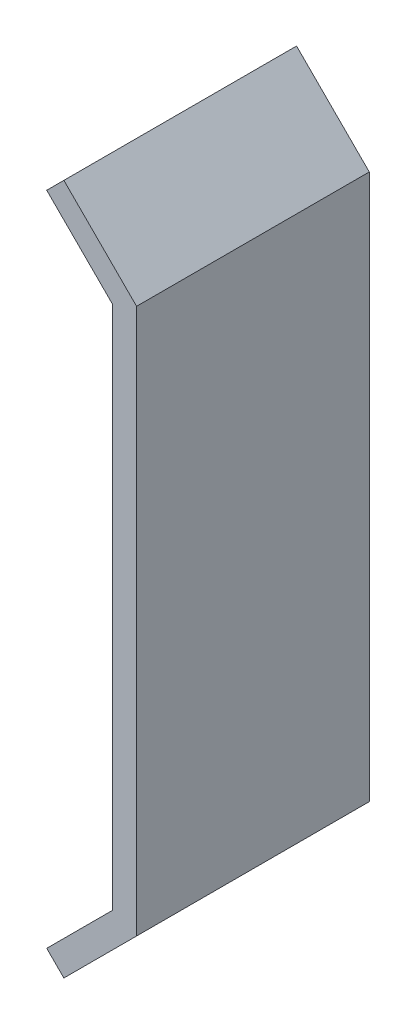
ISO-10303-21;
HEADER;
FILE_DESCRIPTION(('STEP AP214'),'2;1');
FILE_NAME('part.step','',(''),(''),'','','');
FILE_SCHEMA(('AUTOMOTIVE_DESIGN { 1 0 10303 214 1 1 1 1 }'));
ENDSEC;
DATA;
#1=APPLICATION_CONTEXT('core data for automotive mechanical design processes');
#2=APPLICATION_PROTOCOL_DEFINITION('international standard','automotive_design',2000,#1);
#3=PRODUCT_CONTEXT('',#1,'mechanical');
#4=PRODUCT('Part','Part','',(#3));
#5=PRODUCT_RELATED_PRODUCT_CATEGORY('part','',(#4));
#6=PRODUCT_DEFINITION_FORMATION('','',#4);
#7=PRODUCT_DEFINITION_CONTEXT('part definition',#1,'design');
#8=PRODUCT_DEFINITION('design','',#6,#7);
#9=PRODUCT_DEFINITION_SHAPE('','',#8);
#10=(LENGTH_UNIT() NAMED_UNIT(*) SI_UNIT(.MILLI.,.METRE.));
#11=(NAMED_UNIT(*) PLANE_ANGLE_UNIT() SI_UNIT($,.RADIAN.));
#12=(NAMED_UNIT(*) SI_UNIT($,.STERADIAN.) SOLID_ANGLE_UNIT());
#13=UNCERTAINTY_MEASURE_WITH_UNIT(LENGTH_MEASURE(1.E-05),#10,'distance_accuracy_value','');
#14=(GEOMETRIC_REPRESENTATION_CONTEXT(3) GLOBAL_UNCERTAINTY_ASSIGNED_CONTEXT((#13)) GLOBAL_UNIT_ASSIGNED_CONTEXT((#10,
#11,#12)) REPRESENTATION_CONTEXT('',''));
#15=CARTESIAN_POINT('',(0.,0.,0.));
#16=DIRECTION('',(0.,0.,1.));
#17=DIRECTION('',(1.,0.,0.));
#18=AXIS2_PLACEMENT_3D('',#15,#16,#17);
#19=CARTESIAN_POINT('',(-3.,3.00000000000001,1.6));
#20=DIRECTION('',(1.,0.,0.));
#21=DIRECTION('',(0.,0.,-1.));
#22=AXIS2_PLACEMENT_3D('',#19,#20,#21);
#23=PLANE('',#22);
#24=DIRECTION('',(0.,-1.,0.));
#25=VECTOR('',#24,1.);
#26=CARTESIAN_POINT('',(-3.,25.5,1.6));
#27=LINE('',#26,#25);
#28=CARTESIAN_POINT('',(-3.,25.5,1.6));
#29=VERTEX_POINT('',#28);
#30=CARTESIAN_POINT('',(-3.,3.00000000000001,1.6));
#31=VERTEX_POINT('',#30);
#32=EDGE_CURVE('E147',#29,#31,#27,.T.);
#33=ORIENTED_EDGE('',*,*,#32,.F.);
#34=DIRECTION('',(0.,0.,-1.));
#35=VECTOR('',#34,1.);
#36=CARTESIAN_POINT('',(-3.,25.5,1.6));
#37=LINE('',#36,#35);
#38=CARTESIAN_POINT('',(-3.,25.5,0.));
#39=VERTEX_POINT('',#38);
#40=EDGE_CURVE('E146',#29,#39,#37,.T.);
#41=ORIENTED_EDGE('',*,*,#40,.T.);
#42=DIRECTION('',(0.,-1.,0.));
#43=VECTOR('',#42,1.);
#44=CARTESIAN_POINT('',(-3.,3.00000000000001,0.));
#45=LINE('',#44,#43);
#46=CARTESIAN_POINT('',(-3.,3.00000000000001,0.));
#47=VERTEX_POINT('',#46);
#48=EDGE_CURVE('E188',#39,#47,#45,.T.);
#49=ORIENTED_EDGE('',*,*,#48,.T.);
#50=DIRECTION('',(0.,0.,-1.));
#51=VECTOR('',#50,1.);
#52=CARTESIAN_POINT('',(-3.,3.00000000000001,1.6));
#53=LINE('',#52,#51);
#54=EDGE_CURVE('E61',#31,#47,#53,.T.);
#55=ORIENTED_EDGE('',*,*,#54,.F.);
#56=EDGE_LOOP('',(#33,#41,#49,#55));
#57=FACE_BOUND('',#56,.T.);
#58=ADVANCED_FACE('F41',(#57),#23,.F.);
#59=CARTESIAN_POINT('',(3.,2.99999999999999,1.6));
#60=DIRECTION('',(-0.707106781186547,0.707106781186548,0.));
#61=DIRECTION('',(-0.707106781186548,-0.707106781186547,0.));
#62=AXIS2_PLACEMENT_3D('',#59,#60,#61);
#63=PLANE('',#62);
#64=DIRECTION('',(0.707106781186548,0.707106781186547,0.));
#65=VECTOR('',#64,1.);
#66=CARTESIAN_POINT('',(3.,2.99999999999999,0.));
#67=LINE('',#66,#65);
#68=CARTESIAN_POINT('',(0.,0.,0.));
#69=VERTEX_POINT('',#68);
#70=CARTESIAN_POINT('',(3.,2.99999999999999,0.));
#71=VERTEX_POINT('',#70);
#72=EDGE_CURVE('E179',#69,#71,#67,.T.);
#73=ORIENTED_EDGE('',*,*,#72,.T.);
#74=DIRECTION('',(0.,0.,-1.));
#75=VECTOR('',#74,1.);
#76=CARTESIAN_POINT('',(3.,2.99999999999999,1.6));
#77=LINE('',#76,#75);
#78=CARTESIAN_POINT('',(3.,2.99999999999999,9.6));
#79=VERTEX_POINT('',#78);
#80=EDGE_CURVE('E11',#79,#71,#77,.T.);
#81=ORIENTED_EDGE('',*,*,#80,.F.);
#82=DIRECTION('',(0.707106781186548,0.707106781186547,0.));
#83=VECTOR('',#82,1.);
#84=CARTESIAN_POINT('',(0.,0.,9.6));
#85=LINE('',#84,#83);
#86=CARTESIAN_POINT('',(0.,0.,9.6));
#87=VERTEX_POINT('',#86);
#88=EDGE_CURVE('E168',#87,#79,#85,.T.);
#89=ORIENTED_EDGE('',*,*,#88,.F.);
#90=DIRECTION('',(0.,0.,-1.));
#91=VECTOR('',#90,1.);
#92=CARTESIAN_POINT('',(0.,0.,1.6));
#93=LINE('',#92,#91);
#94=EDGE_CURVE('E191',#87,#69,#93,.T.);
#95=ORIENTED_EDGE('',*,*,#94,.T.);
#96=EDGE_LOOP('',(#73,#81,#89,#95));
#97=FACE_BOUND('',#96,.T.);
#98=ADVANCED_FACE('F43',(#97),#63,.F.);
#99=CARTESIAN_POINT('',(3.,25.5,1.6));
#100=DIRECTION('',(-1.,0.,0.));
#101=DIRECTION('',(0.,-1.,0.));
#102=AXIS2_PLACEMENT_3D('',#99,#100,#101);
#103=PLANE('',#102);
#104=DIRECTION('',(0.,1.,0.));
#105=VECTOR('',#104,1.);
#106=CARTESIAN_POINT('',(3.,25.5,0.));
#107=LINE('',#106,#105);
#108=CARTESIAN_POINT('',(3.,25.5,0.));
#109=VERTEX_POINT('',#108);
#110=EDGE_CURVE('E182',#71,#109,#107,.T.);
#111=ORIENTED_EDGE('',*,*,#110,.T.);
#112=DIRECTION('',(0.,0.,-1.));
#113=VECTOR('',#112,1.);
#114=CARTESIAN_POINT('',(3.,25.5,1.6));
#115=LINE('',#114,#113);
#116=CARTESIAN_POINT('',(3.,25.5,9.6));
#117=VERTEX_POINT('',#116);
#118=EDGE_CURVE('E49',#117,#109,#115,.T.);
#119=ORIENTED_EDGE('',*,*,#118,.F.);
#120=DIRECTION('',(0.,1.,0.));
#121=VECTOR('',#120,1.);
#122=CARTESIAN_POINT('',(3.,2.99999999999999,9.6));
#123=LINE('',#122,#121);
#124=EDGE_CURVE('E171',#79,#117,#123,.T.);
#125=ORIENTED_EDGE('',*,*,#124,.F.);
#126=ORIENTED_EDGE('',*,*,#80,.T.);
#127=EDGE_LOOP('',(#111,#119,#125,#126));
#128=FACE_BOUND('',#127,.T.);
#129=ADVANCED_FACE('F212',(#128),#103,.F.);
#130=CARTESIAN_POINT('',(0.,28.5,1.6));
#131=DIRECTION('',(-0.707106781186549,-0.707106781186546,0.));
#132=DIRECTION('',(0.707106781186546,-0.707106781186549,0.));
#133=AXIS2_PLACEMENT_3D('',#130,#131,#132);
#134=PLANE('',#133);
#135=DIRECTION('',(-0.707106781186546,0.707106781186549,0.));
#136=VECTOR('',#135,1.);
#137=CARTESIAN_POINT('',(0.,28.5,0.));
#138=LINE('',#137,#136);
#139=CARTESIAN_POINT('',(0.,28.5,0.));
#140=VERTEX_POINT('',#139);
#141=EDGE_CURVE('E184',#109,#140,#138,.T.);
#142=ORIENTED_EDGE('',*,*,#141,.T.);
#143=DIRECTION('',(0.,0.,-1.));
#144=VECTOR('',#143,1.);
#145=CARTESIAN_POINT('',(0.,28.5,1.6));
#146=LINE('',#145,#144);
#147=CARTESIAN_POINT('',(0.,28.5,9.6));
#148=VERTEX_POINT('',#147);
#149=EDGE_CURVE('E195',#148,#140,#146,.T.);
#150=ORIENTED_EDGE('',*,*,#149,.F.);
#151=DIRECTION('',(-0.707106781186546,0.707106781186549,0.));
#152=VECTOR('',#151,1.);
#153=CARTESIAN_POINT('',(3.,25.5,9.6));
#154=LINE('',#153,#152);
#155=EDGE_CURVE('E174',#117,#148,#154,.T.);
#156=ORIENTED_EDGE('',*,*,#155,.F.);
#157=ORIENTED_EDGE('',*,*,#118,.T.);
#158=EDGE_LOOP('',(#142,#150,#156,#157));
#159=FACE_BOUND('',#158,.T.);
#160=ADVANCED_FACE('F201',(#159),#134,.F.);
#161=CARTESIAN_POINT('',(-3.,25.5,1.6));
#162=DIRECTION('',(0.707106781186546,-0.707106781186548,0.));
#163=DIRECTION('',(0.707106781186549,0.707106781186547,0.));
#164=AXIS2_PLACEMENT_3D('',#161,#162,#163);
#165=PLANE('',#164);
#166=DIRECTION('',(-0.707106781186548,-0.707106781186547,0.));
#167=VECTOR('',#166,1.);
#168=CARTESIAN_POINT('',(-0.707106781186555,27.7928932188135,1.6));
#169=LINE('',#168,#167);
#170=CARTESIAN_POINT('',(-0.707106781186555,27.7928932188135,1.6));
#171=VERTEX_POINT('',#170);
#172=EDGE_CURVE('E123',#171,#29,#169,.T.);
#173=ORIENTED_EDGE('',*,*,#172,.F.);
#174=DIRECTION('',(0.,0.,1.));
#175=VECTOR('',#174,1.);
#176=CARTESIAN_POINT('',(-0.707106781186555,27.7928932188135,1.6));
#177=LINE('',#176,#175);
#178=CARTESIAN_POINT('',(-0.707106781186555,27.7928932188135,9.6));
#179=VERTEX_POINT('',#178);
#180=EDGE_CURVE('E133',#171,#179,#177,.T.);
#181=ORIENTED_EDGE('',*,*,#180,.T.);
#182=DIRECTION('',(-0.707106781186549,-0.707106781186547,0.));
#183=VECTOR('',#182,1.);
#184=CARTESIAN_POINT('',(0.,28.5,9.6));
#185=LINE('',#184,#183);
#186=EDGE_CURVE('E177',#148,#179,#185,.T.);
#187=ORIENTED_EDGE('',*,*,#186,.F.);
#188=ORIENTED_EDGE('',*,*,#149,.T.);
#189=DIRECTION('',(-0.707106781186549,-0.707106781186547,0.));
#190=VECTOR('',#189,1.);
#191=CARTESIAN_POINT('',(-3.,25.5,0.));
#192=LINE('',#191,#190);
#193=EDGE_CURVE('E186',#140,#39,#192,.T.);
#194=ORIENTED_EDGE('',*,*,#193,.T.);
#195=ORIENTED_EDGE('',*,*,#40,.F.);
#196=EDGE_LOOP('',(#173,#181,#187,#188,#194,#195));
#197=FACE_BOUND('',#196,.T.);
#198=ADVANCED_FACE('F144',(#197),#165,.F.);
#199=CARTESIAN_POINT('',(0.,0.,1.6));
#200=DIRECTION('',(0.707106781186549,0.707106781186546,0.));
#201=DIRECTION('',(-0.707106781186546,0.707106781186549,0.));
#202=AXIS2_PLACEMENT_3D('',#199,#200,#201);
#203=PLANE('',#202);
#204=DIRECTION('',(0.707106781186546,-0.707106781186549,0.));
#205=VECTOR('',#204,1.);
#206=CARTESIAN_POINT('',(-3.,3.00000000000001,9.6));
#207=LINE('',#206,#205);
#208=CARTESIAN_POINT('',(-0.707106781186543,0.707106781186552,9.6));
#209=VERTEX_POINT('',#208);
#210=EDGE_CURVE('E166',#209,#87,#207,.T.);
#211=ORIENTED_EDGE('',*,*,#210,.F.);
#212=DIRECTION('',(0.,0.,1.));
#213=VECTOR('',#212,1.);
#214=CARTESIAN_POINT('',(-0.707106781186543,0.707106781186552,1.6));
#215=LINE('',#214,#213);
#216=CARTESIAN_POINT('',(-0.707106781186543,0.707106781186552,1.6));
#217=VERTEX_POINT('',#216);
#218=EDGE_CURVE('E140',#217,#209,#215,.T.);
#219=ORIENTED_EDGE('',*,*,#218,.F.);
#220=DIRECTION('',(0.707106781186548,-0.707106781186548,0.));
#221=VECTOR('',#220,1.);
#222=CARTESIAN_POINT('',(-3.,3.00000000000001,1.6));
#223=LINE('',#222,#221);
#224=EDGE_CURVE('E141',#31,#217,#223,.T.);
#225=ORIENTED_EDGE('',*,*,#224,.F.);
#226=ORIENTED_EDGE('',*,*,#54,.T.);
#227=DIRECTION('',(0.707106781186546,-0.707106781186549,0.));
#228=VECTOR('',#227,1.);
#229=CARTESIAN_POINT('',(0.,0.,0.));
#230=LINE('',#229,#228);
#231=EDGE_CURVE('E56',#47,#69,#230,.T.);
#232=ORIENTED_EDGE('',*,*,#231,.T.);
#233=ORIENTED_EDGE('',*,*,#94,.F.);
#234=EDGE_LOOP('',(#211,#219,#225,#226,#232,#233));
#235=FACE_BOUND('',#234,.T.);
#236=ADVANCED_FACE('F215',(#235),#203,.F.);
#237=CARTESIAN_POINT('',(0.,0.,0.));
#238=DIRECTION('',(0.,0.,-1.));
#239=DIRECTION('',(-1.,0.,0.));
#240=AXIS2_PLACEMENT_3D('',#237,#238,#239);
#241=PLANE('',#240);
#242=ORIENTED_EDGE('',*,*,#72,.F.);
#243=ORIENTED_EDGE('',*,*,#231,.F.);
#244=ORIENTED_EDGE('',*,*,#48,.F.);
#245=ORIENTED_EDGE('',*,*,#193,.F.);
#246=ORIENTED_EDGE('',*,*,#141,.F.);
#247=ORIENTED_EDGE('',*,*,#110,.F.);
#248=EDGE_LOOP('',(#242,#243,#244,#245,#246,#247));
#249=FACE_BOUND('',#248,.T.);
#250=ADVANCED_FACE('F207',(#249),#241,.T.);
#251=CARTESIAN_POINT('',(0.,0.,9.6));
#252=DIRECTION('',(0.,0.,1.));
#253=DIRECTION('',(1.,0.,0.));
#254=AXIS2_PLACEMENT_3D('',#251,#252,#253);
#255=PLANE('',#254);
#256=DIRECTION('',(0.707106781186547,0.707106781186547,0.));
#257=VECTOR('',#256,1.);
#258=CARTESIAN_POINT('',(0.,1.4142135623731,9.6));
#259=LINE('',#258,#257);
#260=CARTESIAN_POINT('',(2.,3.4142135623731,9.6));
#261=VERTEX_POINT('',#260);
#262=EDGE_CURVE('E130',#209,#261,#259,.T.);
#263=ORIENTED_EDGE('',*,*,#262,.F.);
#264=ORIENTED_EDGE('',*,*,#210,.T.);
#265=ORIENTED_EDGE('',*,*,#88,.T.);
#266=ORIENTED_EDGE('',*,*,#124,.T.);
#267=ORIENTED_EDGE('',*,*,#155,.T.);
#268=ORIENTED_EDGE('',*,*,#186,.T.);
#269=DIRECTION('',(-0.707106781186548,0.707106781186547,0.));
#270=VECTOR('',#269,1.);
#271=CARTESIAN_POINT('',(2.,25.0857864376269,9.6));
#272=LINE('',#271,#270);
#273=CARTESIAN_POINT('',(2.,25.0857864376269,9.6));
#274=VERTEX_POINT('',#273);
#275=EDGE_CURVE('E136',#274,#179,#272,.T.);
#276=ORIENTED_EDGE('',*,*,#275,.F.);
#277=DIRECTION('',(0.,1.,0.));
#278=VECTOR('',#277,1.);
#279=CARTESIAN_POINT('',(2.,3.4142135623731,9.6));
#280=LINE('',#279,#278);
#281=EDGE_CURVE('E157',#261,#274,#280,.T.);
#282=ORIENTED_EDGE('',*,*,#281,.F.);
#283=EDGE_LOOP('',(#263,#264,#265,#266,#267,#268,#276,#282));
#284=FACE_BOUND('',#283,.T.);
#285=ADVANCED_FACE('F210',(#284),#255,.T.);
#286=CARTESIAN_POINT('',(0.,1.4142135623731,9.6));
#287=DIRECTION('',(-0.707106781186547,0.707106781186547,0.));
#288=DIRECTION('',(-0.707106781186548,-0.707106781186548,0.));
#289=AXIS2_PLACEMENT_3D('',#286,#287,#288);
#290=PLANE('',#289);
#291=DIRECTION('',(0.707106781186547,0.707106781186547,0.));
#292=VECTOR('',#291,1.);
#293=CARTESIAN_POINT('',(0.,1.4142135623731,1.6));
#294=LINE('',#293,#292);
#295=CARTESIAN_POINT('',(2.,3.4142135623731,1.6));
#296=VERTEX_POINT('',#295);
#297=EDGE_CURVE('E154',#217,#296,#294,.T.);
#298=ORIENTED_EDGE('',*,*,#297,.F.);
#299=ORIENTED_EDGE('',*,*,#218,.T.);
#300=ORIENTED_EDGE('',*,*,#262,.T.);
#301=DIRECTION('',(0.,0.,-1.));
#302=VECTOR('',#301,1.);
#303=CARTESIAN_POINT('',(2.,3.4142135623731,9.6));
#304=LINE('',#303,#302);
#305=EDGE_CURVE('E164',#261,#296,#304,.T.);
#306=ORIENTED_EDGE('',*,*,#305,.T.);
#307=EDGE_LOOP('',(#298,#299,#300,#306));
#308=FACE_BOUND('',#307,.T.);
#309=ADVANCED_FACE('F220',(#308),#290,.T.);
#310=CARTESIAN_POINT('',(2.,3.4142135623731,9.6));
#311=DIRECTION('',(-1.,0.,0.));
#312=DIRECTION('',(0.,0.,1.));
#313=AXIS2_PLACEMENT_3D('',#310,#311,#312);
#314=PLANE('',#313);
#315=DIRECTION('',(0.,1.,0.));
#316=VECTOR('',#315,1.);
#317=CARTESIAN_POINT('',(2.,3.4142135623731,1.6));
#318=LINE('',#317,#316);
#319=CARTESIAN_POINT('',(2.,25.0857864376269,1.6));
#320=VERTEX_POINT('',#319);
#321=EDGE_CURVE('E127',#296,#320,#318,.T.);
#322=ORIENTED_EDGE('',*,*,#321,.F.);
#323=ORIENTED_EDGE('',*,*,#305,.F.);
#324=ORIENTED_EDGE('',*,*,#281,.T.);
#325=DIRECTION('',(0.,0.,-1.));
#326=VECTOR('',#325,1.);
#327=CARTESIAN_POINT('',(2.,25.0857864376269,9.6));
#328=LINE('',#327,#326);
#329=EDGE_CURVE('E160',#274,#320,#328,.T.);
#330=ORIENTED_EDGE('',*,*,#329,.T.);
#331=EDGE_LOOP('',(#322,#323,#324,#330));
#332=FACE_BOUND('',#331,.T.);
#333=ADVANCED_FACE('F249',(#332),#314,.T.);
#334=CARTESIAN_POINT('',(2.,25.0857864376269,9.6));
#335=DIRECTION('',(-0.707106781186547,-0.707106781186548,0.));
#336=DIRECTION('',(0.707106781186548,-0.707106781186547,0.));
#337=AXIS2_PLACEMENT_3D('',#334,#335,#336);
#338=PLANE('',#337);
#339=DIRECTION('',(-0.707106781186548,0.707106781186547,0.));
#340=VECTOR('',#339,1.);
#341=CARTESIAN_POINT('',(2.,25.0857864376269,1.6));
#342=LINE('',#341,#340);
#343=EDGE_CURVE('E119',#320,#171,#342,.T.);
#344=ORIENTED_EDGE('',*,*,#343,.F.);
#345=ORIENTED_EDGE('',*,*,#329,.F.);
#346=ORIENTED_EDGE('',*,*,#275,.T.);
#347=ORIENTED_EDGE('',*,*,#180,.F.);
#348=EDGE_LOOP('',(#344,#345,#346,#347));
#349=FACE_BOUND('',#348,.T.);
#350=ADVANCED_FACE('F134',(#349),#338,.T.);
#351=CARTESIAN_POINT('',(0.,0.,1.6));
#352=DIRECTION('',(0.,0.,-1.));
#353=DIRECTION('',(-1.,0.,0.));
#354=AXIS2_PLACEMENT_3D('',#351,#352,#353);
#355=PLANE('',#354);
#356=ORIENTED_EDGE('',*,*,#343,.T.);
#357=ORIENTED_EDGE('',*,*,#172,.T.);
#358=ORIENTED_EDGE('',*,*,#32,.T.);
#359=ORIENTED_EDGE('',*,*,#224,.T.);
#360=ORIENTED_EDGE('',*,*,#297,.T.);
#361=ORIENTED_EDGE('',*,*,#321,.T.);
#362=EDGE_LOOP('',(#356,#357,#358,#359,#360,#361));
#363=FACE_BOUND('',#362,.T.);
#364=ADVANCED_FACE('F121',(#363),#355,.F.);
#365=CLOSED_SHELL('',(#58,#98,#129,#160,#198,#236,#250,#285,#309,#333,#350,#364));
#366=MANIFOLD_SOLID_BREP('B2',#365);
#367=ADVANCED_BREP_SHAPE_REPRESENTATION('',(#18,#366),#14);
#368=SHAPE_DEFINITION_REPRESENTATION(#9,#367);
ENDSEC;
END-ISO-10303-21;
